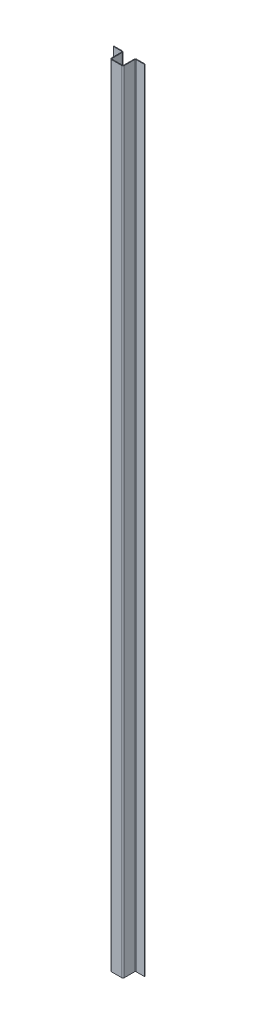
ISO-10303-21;
HEADER;
FILE_DESCRIPTION(('STEP AP214'),'2;1');
FILE_NAME('part.step','',(''),(''),'','','');
FILE_SCHEMA(('AUTOMOTIVE_DESIGN { 1 0 10303 214 1 1 1 1 }'));
ENDSEC;
DATA;
#1=APPLICATION_CONTEXT('core data for automotive mechanical design processes');
#2=APPLICATION_PROTOCOL_DEFINITION('international standard','automotive_design',2000,#1);
#3=PRODUCT_CONTEXT('',#1,'mechanical');
#4=PRODUCT('Part','Part','',(#3));
#5=PRODUCT_RELATED_PRODUCT_CATEGORY('part','',(#4));
#6=PRODUCT_DEFINITION_FORMATION('','',#4);
#7=PRODUCT_DEFINITION_CONTEXT('part definition',#1,'design');
#8=PRODUCT_DEFINITION('design','',#6,#7);
#9=PRODUCT_DEFINITION_SHAPE('','',#8);
#10=(LENGTH_UNIT() NAMED_UNIT(*) SI_UNIT(.MILLI.,.METRE.));
#11=(NAMED_UNIT(*) PLANE_ANGLE_UNIT() SI_UNIT($,.RADIAN.));
#12=(NAMED_UNIT(*) SI_UNIT($,.STERADIAN.) SOLID_ANGLE_UNIT());
#13=UNCERTAINTY_MEASURE_WITH_UNIT(LENGTH_MEASURE(1.E-05),#10,'distance_accuracy_value','');
#14=(GEOMETRIC_REPRESENTATION_CONTEXT(3) GLOBAL_UNCERTAINTY_ASSIGNED_CONTEXT((#13)) GLOBAL_UNIT_ASSIGNED_CONTEXT((#10,
#11,#12)) REPRESENTATION_CONTEXT('',''));
#15=CARTESIAN_POINT('',(0.,0.,0.));
#16=DIRECTION('',(0.,0.,1.));
#17=DIRECTION('',(1.,0.,0.));
#18=AXIS2_PLACEMENT_3D('',#15,#16,#17);
#19=CARTESIAN_POINT('',(19.9999999999963,-1214.,-40.0000000000007));
#20=DIRECTION('',(0.,1.,0.));
#21=DIRECTION('',(0.,0.,1.));
#22=AXIS2_PLACEMENT_3D('',#19,#20,#21);
#23=PLANE('',#22);
#24=DIRECTION('',(-1.,0.,0.));
#25=VECTOR('',#24,1.);
#26=CARTESIAN_POINT('',(19.999999999997,-1214.,-35.5000000000014));
#27=LINE('',#26,#25);
#28=CARTESIAN_POINT('',(19.999999999997,-1214.,-35.5000000000014));
#29=VERTEX_POINT('',#28);
#30=CARTESIAN_POINT('',(17.9999999999962,-1214.,-35.500000000001));
#31=VERTEX_POINT('',#30);
#32=EDGE_CURVE('E316',#29,#31,#27,.T.);
#33=ORIENTED_EDGE('',*,*,#32,.F.);
#34=DIRECTION('',(0.,0.,-1.));
#35=VECTOR('',#34,1.);
#36=CARTESIAN_POINT('',(19.9999999999962,-1214.,-2.22044604925031E-13));
#37=LINE('',#36,#35);
#38=CARTESIAN_POINT('',(19.9999999999964,-1214.,-4.5000000000015));
#39=VERTEX_POINT('',#38);
#40=EDGE_CURVE('E418',#39,#29,#37,.T.);
#41=ORIENTED_EDGE('',*,*,#40,.F.);
#42=DIRECTION('',(-1.,0.,0.));
#43=VECTOR('',#42,1.);
#44=CARTESIAN_POINT('',(17.999999999996,-1214.,-4.50000000000106));
#45=LINE('',#44,#43);
#46=CARTESIAN_POINT('',(17.999999999996,-1214.,-4.50000000000106));
#47=VERTEX_POINT('',#46);
#48=EDGE_CURVE('E429',#47,#39,#45,.F.);
#49=ORIENTED_EDGE('',*,*,#48,.F.);
#50=DIRECTION('',(0.,0.,1.));
#51=VECTOR('',#50,1.);
#52=CARTESIAN_POINT('',(17.9999999999965,-1214.,-40.0000000000018));
#53=LINE('',#52,#51);
#54=EDGE_CURVE('E423',#47,#31,#53,.F.);
#55=ORIENTED_EDGE('',*,*,#54,.T.);
#56=EDGE_LOOP('',(#33,#41,#49,#55));
#57=FACE_BOUND('',#56,.T.);
#58=ADVANCED_FACE('F120',(#57),#23,.F.);
#59=CARTESIAN_POINT('',(20.0000000000028,1214.,-2.00000000000156));
#60=DIRECTION('',(0.,-1.,0.));
#61=DIRECTION('',(0.,0.,-1.));
#62=AXIS2_PLACEMENT_3D('',#59,#60,#61);
#63=PLANE('',#62);
#64=DIRECTION('',(-1.,0.,0.));
#65=VECTOR('',#64,1.);
#66=CARTESIAN_POINT('',(20.0000000000032,1214.,-35.5000000000003));
#67=LINE('',#66,#65);
#68=CARTESIAN_POINT('',(20.0000000000032,1214.,-35.5000000000003));
#69=VERTEX_POINT('',#68);
#70=CARTESIAN_POINT('',(18.0000000000024,1214.,-35.5000000000001));
#71=VERTEX_POINT('',#70);
#72=EDGE_CURVE('E305',#69,#71,#67,.T.);
#73=ORIENTED_EDGE('',*,*,#72,.T.);
#74=DIRECTION('',(0.,0.,-1.));
#75=VECTOR('',#74,1.);
#76=CARTESIAN_POINT('',(18.0000000000025,1214.,-2.00000000000067));
#77=LINE('',#76,#75);
#78=CARTESIAN_POINT('',(18.0000000000022,1214.,-4.50000000000017));
#79=VERTEX_POINT('',#78);
#80=EDGE_CURVE('E421',#71,#79,#77,.F.);
#81=ORIENTED_EDGE('',*,*,#80,.T.);
#82=DIRECTION('',(-1.,0.,0.));
#83=VECTOR('',#82,1.);
#84=CARTESIAN_POINT('',(20.0000000000025,1214.,-4.50000000000084));
#85=LINE('',#84,#83);
#86=CARTESIAN_POINT('',(20.0000000000025,1214.,-4.50000000000084));
#87=VERTEX_POINT('',#86);
#88=EDGE_CURVE('E412',#79,#87,#85,.F.);
#89=ORIENTED_EDGE('',*,*,#88,.T.);
#90=DIRECTION('',(0.,0.,1.));
#91=VECTOR('',#90,1.);
#92=CARTESIAN_POINT('',(20.0000000000026,1214.,-4.44089209850063E-13));
#93=LINE('',#92,#91);
#94=EDGE_CURVE('E415',#69,#87,#93,.T.);
#95=ORIENTED_EDGE('',*,*,#94,.F.);
#96=EDGE_LOOP('',(#73,#81,#89,#95));
#97=FACE_BOUND('',#96,.T.);
#98=ADVANCED_FACE('F514',(#97),#63,.F.);
#99=CARTESIAN_POINT('',(20.,0.,4.44089209850063E-13));
#100=DIRECTION('',(-1.,0.,0.));
#101=DIRECTION('',(0.,0.,1.));
#102=AXIS2_PLACEMENT_3D('',#99,#100,#101);
#103=PLANE('',#102);
#104=DIRECTION('',(0.,1.,0.));
#105=VECTOR('',#104,1.);
#106=CARTESIAN_POINT('',(20.0000000000032,1214.,-35.5000000000003));
#107=LINE('',#106,#105);
#108=EDGE_CURVE('E311',#69,#29,#107,.F.);
#109=ORIENTED_EDGE('',*,*,#108,.F.);
#110=ORIENTED_EDGE('',*,*,#94,.T.);
#111=DIRECTION('',(0.,-1.,0.));
#112=VECTOR('',#111,1.);
#113=CARTESIAN_POINT('',(20.0000000000025,1214.,-4.50000000000084));
#114=LINE('',#113,#112);
#115=EDGE_CURVE('E426',#39,#87,#114,.F.);
#116=ORIENTED_EDGE('',*,*,#115,.F.);
#117=ORIENTED_EDGE('',*,*,#40,.T.);
#118=EDGE_LOOP('',(#109,#110,#116,#117));
#119=FACE_BOUND('',#118,.T.);
#120=ADVANCED_FACE('F520',(#119),#103,.F.);
#121=CARTESIAN_POINT('',(18.0000000000002,-1.11022302462516E-13,4.44089209850063E-13));
#122=DIRECTION('',(-1.,0.,0.));
#123=DIRECTION('',(0.,0.,1.));
#124=AXIS2_PLACEMENT_3D('',#121,#122,#123);
#125=PLANE('',#124);
#126=ORIENTED_EDGE('',*,*,#80,.F.);
#127=DIRECTION('',(0.,1.,0.));
#128=VECTOR('',#127,1.);
#129=CARTESIAN_POINT('',(18.0000000000024,1214.,-35.5000000000001));
#130=LINE('',#129,#128);
#131=EDGE_CURVE('E300',#71,#31,#130,.F.);
#132=ORIENTED_EDGE('',*,*,#131,.T.);
#133=ORIENTED_EDGE('',*,*,#54,.F.);
#134=DIRECTION('',(0.,-1.,0.));
#135=VECTOR('',#134,1.);
#136=CARTESIAN_POINT('',(18.0000000000022,1214.,-4.50000000000017));
#137=LINE('',#136,#135);
#138=EDGE_CURVE('E432',#79,#47,#137,.T.);
#139=ORIENTED_EDGE('',*,*,#138,.F.);
#140=EDGE_LOOP('',(#126,#132,#133,#139));
#141=FACE_BOUND('',#140,.T.);
#142=ADVANCED_FACE('F821',(#141),#125,.T.);
#143=CARTESIAN_POINT('',(-19.9999999999983,1214.,-40.));
#144=DIRECTION('',(0.,-1.,0.));
#145=DIRECTION('',(0.,0.,-1.));
#146=AXIS2_PLACEMENT_3D('',#143,#144,#145);
#147=PLANE('',#146);
#148=DIRECTION('',(1.,0.,0.));
#149=VECTOR('',#148,1.);
#150=CARTESIAN_POINT('',(-19.9999999999984,1214.,-35.4999999999996));
#151=LINE('',#150,#149);
#152=CARTESIAN_POINT('',(-19.9999999999984,1214.,-35.4999999999996));
#153=VERTEX_POINT('',#152);
#154=CARTESIAN_POINT('',(-17.9999999999977,1214.,-35.4999999999996));
#155=VERTEX_POINT('',#154);
#156=EDGE_CURVE('E366',#153,#155,#151,.T.);
#157=ORIENTED_EDGE('',*,*,#156,.F.);
#158=DIRECTION('',(0.,0.,-1.));
#159=VECTOR('',#158,1.);
#160=CARTESIAN_POINT('',(-19.9999999999973,1214.,-4.44089209850063E-13));
#161=LINE('',#160,#159);
#162=CARTESIAN_POINT('',(-19.9999999999981,1214.,-4.4999999999995));
#163=VERTEX_POINT('',#162);
#164=EDGE_CURVE('E374',#163,#153,#161,.T.);
#165=ORIENTED_EDGE('',*,*,#164,.F.);
#166=DIRECTION('',(1.,0.,0.));
#167=VECTOR('',#166,1.);
#168=CARTESIAN_POINT('',(-17.999999999998,1214.,-4.49999999999973));
#169=LINE('',#168,#167);
#170=CARTESIAN_POINT('',(-17.999999999998,1214.,-4.49999999999973));
#171=VERTEX_POINT('',#170);
#172=EDGE_CURVE('E385',#171,#163,#169,.F.);
#173=ORIENTED_EDGE('',*,*,#172,.F.);
#174=DIRECTION('',(0.,0.,1.));
#175=VECTOR('',#174,1.);
#176=CARTESIAN_POINT('',(-17.9999999999971,1214.,-40.));
#177=LINE('',#176,#175);
#178=EDGE_CURVE('E379',#171,#155,#177,.F.);
#179=ORIENTED_EDGE('',*,*,#178,.T.);
#180=EDGE_LOOP('',(#157,#165,#173,#179));
#181=FACE_BOUND('',#180,.T.);
#182=ADVANCED_FACE('F494',(#181),#147,.F.);
#183=CARTESIAN_POINT('',(-20.0000000000038,-1214.,-1.99999999999867));
#184=DIRECTION('',(0.,1.,0.));
#185=DIRECTION('',(0.,0.,1.));
#186=AXIS2_PLACEMENT_3D('',#183,#184,#185);
#187=PLANE('',#186);
#188=DIRECTION('',(1.,0.,0.));
#189=VECTOR('',#188,1.);
#190=CARTESIAN_POINT('',(-20.0000000000042,-1214.,-35.5000000000001));
#191=LINE('',#190,#189);
#192=CARTESIAN_POINT('',(-20.0000000000042,-1214.,-35.5000000000001));
#193=VERTEX_POINT('',#192);
#194=CARTESIAN_POINT('',(-18.0000000000037,-1214.,-35.4999999999996));
#195=VERTEX_POINT('',#194);
#196=EDGE_CURVE('E356',#193,#195,#191,.T.);
#197=ORIENTED_EDGE('',*,*,#196,.T.);
#198=DIRECTION('',(0.,0.,-1.));
#199=VECTOR('',#198,1.);
#200=CARTESIAN_POINT('',(-18.0000000000035,-1214.,-1.99999999999911));
#201=LINE('',#200,#199);
#202=CARTESIAN_POINT('',(-18.0000000000031,-1214.,-4.49999999999973));
#203=VERTEX_POINT('',#202);
#204=EDGE_CURVE('E377',#195,#203,#201,.F.);
#205=ORIENTED_EDGE('',*,*,#204,.T.);
#206=DIRECTION('',(1.,0.,0.));
#207=VECTOR('',#206,1.);
#208=CARTESIAN_POINT('',(-20.0000000000031,-1214.,-4.49999999999973));
#209=LINE('',#208,#207);
#210=CARTESIAN_POINT('',(-20.0000000000031,-1214.,-4.49999999999973));
#211=VERTEX_POINT('',#210);
#212=EDGE_CURVE('E368',#203,#211,#209,.F.);
#213=ORIENTED_EDGE('',*,*,#212,.T.);
#214=DIRECTION('',(0.,0.,1.));
#215=VECTOR('',#214,1.);
#216=CARTESIAN_POINT('',(-20.0000000000028,-1214.,4.44089209850063E-13));
#217=LINE('',#216,#215);
#218=EDGE_CURVE('E371',#193,#211,#217,.T.);
#219=ORIENTED_EDGE('',*,*,#218,.F.);
#220=EDGE_LOOP('',(#197,#205,#213,#219));
#221=FACE_BOUND('',#220,.T.);
#222=ADVANCED_FACE('F841',(#221),#187,.F.);
#223=CARTESIAN_POINT('',(-20.0000000000005,0.,-4.44089209850063E-13));
#224=DIRECTION('',(1.,0.,0.));
#225=DIRECTION('',(0.,0.,-1.));
#226=AXIS2_PLACEMENT_3D('',#223,#224,#225);
#227=PLANE('',#226);
#228=DIRECTION('',(0.,-1.,0.));
#229=VECTOR('',#228,1.);
#230=CARTESIAN_POINT('',(-20.0000000000042,-1214.,-35.5000000000001));
#231=LINE('',#230,#229);
#232=EDGE_CURVE('E362',#193,#153,#231,.F.);
#233=ORIENTED_EDGE('',*,*,#232,.F.);
#234=ORIENTED_EDGE('',*,*,#218,.T.);
#235=DIRECTION('',(0.,1.,0.));
#236=VECTOR('',#235,1.);
#237=CARTESIAN_POINT('',(-20.0000000000031,-1214.,-4.49999999999973));
#238=LINE('',#237,#236);
#239=EDGE_CURVE('E382',#163,#211,#238,.F.);
#240=ORIENTED_EDGE('',*,*,#239,.F.);
#241=ORIENTED_EDGE('',*,*,#164,.T.);
#242=EDGE_LOOP('',(#233,#234,#240,#241));
#243=FACE_BOUND('',#242,.T.);
#244=ADVANCED_FACE('F499',(#243),#227,.F.);
#245=CARTESIAN_POINT('',(-18.,-2.22044604925031E-13,-4.44089209850063E-13));
#246=DIRECTION('',(1.,0.,0.));
#247=DIRECTION('',(0.,0.,-1.));
#248=AXIS2_PLACEMENT_3D('',#245,#246,#247);
#249=PLANE('',#248);
#250=ORIENTED_EDGE('',*,*,#204,.F.);
#251=DIRECTION('',(0.,-1.,0.));
#252=VECTOR('',#251,1.);
#253=CARTESIAN_POINT('',(-18.0000000000037,-1214.,-35.4999999999996));
#254=LINE('',#253,#252);
#255=EDGE_CURVE('E351',#195,#155,#254,.F.);
#256=ORIENTED_EDGE('',*,*,#255,.T.);
#257=ORIENTED_EDGE('',*,*,#178,.F.);
#258=DIRECTION('',(0.,1.,0.));
#259=VECTOR('',#258,1.);
#260=CARTESIAN_POINT('',(-18.0000000000031,-1214.,-4.49999999999973));
#261=LINE('',#260,#259);
#262=EDGE_CURVE('E388',#203,#171,#261,.T.);
#263=ORIENTED_EDGE('',*,*,#262,.F.);
#264=EDGE_LOOP('',(#250,#256,#257,#263));
#265=FACE_BOUND('',#264,.T.);
#266=ADVANCED_FACE('F491',(#265),#249,.T.);
#267=CARTESIAN_POINT('',(-7.7715611723761E-13,-2.22044604925031E-13,-2.00000000000067));
#268=DIRECTION('',(0.,0.,1.));
#269=DIRECTION('',(1.,0.,0.));
#270=AXIS2_PLACEMENT_3D('',#267,#268,#269);
#271=PLANE('',#270);
#272=DIRECTION('',(0.,1.,0.));
#273=VECTOR('',#272,1.);
#274=CARTESIAN_POINT('',(-15.4999999999981,1214.,-1.99999999999911));
#275=LINE('',#274,#273);
#276=CARTESIAN_POINT('',(-15.4999999999981,1214.,-1.99999999999911));
#277=VERTEX_POINT('',#276);
#278=CARTESIAN_POINT('',(-15.5000000000037,-1214.,-1.99999999999978));
#279=VERTEX_POINT('',#278);
#280=EDGE_CURVE('E405',#277,#279,#275,.F.);
#281=ORIENTED_EDGE('',*,*,#280,.F.);
#282=DIRECTION('',(-1.,0.,0.));
#283=VECTOR('',#282,1.);
#284=CARTESIAN_POINT('',(20.0000000000028,1214.,-2.00000000000156));
#285=LINE('',#284,#283);
#286=CARTESIAN_POINT('',(15.5000000000022,1214.,-2.00000000000067));
#287=VERTEX_POINT('',#286);
#288=EDGE_CURVE('E13',#287,#277,#285,.T.);
#289=ORIENTED_EDGE('',*,*,#288,.F.);
#290=DIRECTION('',(0.,-1.,0.));
#291=VECTOR('',#290,1.);
#292=CARTESIAN_POINT('',(15.499999999997,-1214.,-2.000000000002));
#293=LINE('',#292,#291);
#294=CARTESIAN_POINT('',(15.499999999997,-1214.,-2.000000000002));
#295=VERTEX_POINT('',#294);
#296=EDGE_CURVE('E449',#295,#287,#293,.F.);
#297=ORIENTED_EDGE('',*,*,#296,.F.);
#298=DIRECTION('',(1.,0.,0.));
#299=VECTOR('',#298,1.);
#300=CARTESIAN_POINT('',(19.9999999999967,-1214.,-2.00000000000156));
#301=LINE('',#300,#299);
#302=EDGE_CURVE('E129',#279,#295,#301,.T.);
#303=ORIENTED_EDGE('',*,*,#302,.F.);
#304=EDGE_LOOP('',(#281,#289,#297,#303));
#305=FACE_BOUND('',#304,.T.);
#306=ADVANCED_FACE('F481',(#305),#271,.F.);
#307=CARTESIAN_POINT('',(0.,0.,0.));
#308=DIRECTION('',(0.,0.,1.));
#309=DIRECTION('',(1.,0.,0.));
#310=AXIS2_PLACEMENT_3D('',#307,#308,#309);
#311=PLANE('',#310);
#312=DIRECTION('',(-1.,0.,0.));
#313=VECTOR('',#312,1.);
#314=CARTESIAN_POINT('',(20.0000000000026,1214.,-4.44089209850063E-13));
#315=LINE('',#314,#313);
#316=CARTESIAN_POINT('',(15.5000000000021,1214.,2.22044604925031E-13));
#317=VERTEX_POINT('',#316);
#318=CARTESIAN_POINT('',(-15.4999999999975,1214.,-8.88178419700125E-13));
#319=VERTEX_POINT('',#318);
#320=EDGE_CURVE('E124',#317,#319,#315,.T.);
#321=ORIENTED_EDGE('',*,*,#320,.T.);
#322=DIRECTION('',(0.,1.,0.));
#323=VECTOR('',#322,1.);
#324=CARTESIAN_POINT('',(-15.4999999999975,1214.,-8.88178419700125E-13));
#325=LINE('',#324,#323);
#326=CARTESIAN_POINT('',(-15.5000000000031,-1214.,1.55431223447522E-12));
#327=VERTEX_POINT('',#326);
#328=EDGE_CURVE('E392',#319,#327,#325,.F.);
#329=ORIENTED_EDGE('',*,*,#328,.T.);
#330=DIRECTION('',(1.,0.,0.));
#331=VECTOR('',#330,1.);
#332=CARTESIAN_POINT('',(19.9999999999962,-1214.,-2.22044604925031E-13));
#333=LINE('',#332,#331);
#334=CARTESIAN_POINT('',(15.4999999999961,-1214.,-4.44089209850063E-13));
#335=VERTEX_POINT('',#334);
#336=EDGE_CURVE('E456',#327,#335,#333,.T.);
#337=ORIENTED_EDGE('',*,*,#336,.T.);
#338=DIRECTION('',(0.,-1.,0.));
#339=VECTOR('',#338,1.);
#340=CARTESIAN_POINT('',(15.4999999999961,-1214.,-4.44089209850063E-13));
#341=LINE('',#340,#339);
#342=EDGE_CURVE('E436',#335,#317,#341,.F.);
#343=ORIENTED_EDGE('',*,*,#342,.T.);
#344=EDGE_LOOP('',(#321,#329,#337,#343));
#345=FACE_BOUND('',#344,.T.);
#346=ADVANCED_FACE('F465',(#345),#311,.T.);
#347=CARTESIAN_POINT('',(20.0000000000028,1214.,-2.00000000000156));
#348=DIRECTION('',(0.,1.,0.));
#349=DIRECTION('',(0.,0.,1.));
#350=AXIS2_PLACEMENT_3D('',#347,#348,#349);
#351=PLANE('',#350);
#352=ORIENTED_EDGE('',*,*,#288,.T.);
#353=DIRECTION('',(0.,0.,1.));
#354=VECTOR('',#353,1.);
#355=CARTESIAN_POINT('',(-15.4999999999981,1214.,-1.99999999999911));
#356=LINE('',#355,#354);
#357=EDGE_CURVE('E399',#277,#319,#356,.T.);
#358=ORIENTED_EDGE('',*,*,#357,.T.);
#359=ORIENTED_EDGE('',*,*,#320,.F.);
#360=DIRECTION('',(0.,0.,1.));
#361=VECTOR('',#360,1.);
#362=CARTESIAN_POINT('',(15.5000000000022,1214.,-2.00000000000067));
#363=LINE('',#362,#361);
#364=EDGE_CURVE('E453',#287,#317,#363,.T.);
#365=ORIENTED_EDGE('',*,*,#364,.F.);
#366=EDGE_LOOP('',(#352,#358,#359,#365));
#367=FACE_BOUND('',#366,.T.);
#368=ADVANCED_FACE('F468',(#367),#351,.T.);
#369=CARTESIAN_POINT('',(19.9999999999967,-1214.,-2.00000000000156));
#370=DIRECTION('',(0.,-1.,0.));
#371=DIRECTION('',(0.,0.,-1.));
#372=AXIS2_PLACEMENT_3D('',#369,#370,#371);
#373=PLANE('',#372);
#374=DIRECTION('',(0.,0.,1.));
#375=VECTOR('',#374,1.);
#376=CARTESIAN_POINT('',(-15.5000000000037,-1214.,-1.99999999999978));
#377=LINE('',#376,#375);
#378=EDGE_CURVE('E409',#279,#327,#377,.T.);
#379=ORIENTED_EDGE('',*,*,#378,.F.);
#380=ORIENTED_EDGE('',*,*,#302,.T.);
#381=DIRECTION('',(0.,0.,1.));
#382=VECTOR('',#381,1.);
#383=CARTESIAN_POINT('',(15.499999999997,-1214.,-2.000000000002));
#384=LINE('',#383,#382);
#385=EDGE_CURVE('E443',#295,#335,#384,.T.);
#386=ORIENTED_EDGE('',*,*,#385,.T.);
#387=ORIENTED_EDGE('',*,*,#336,.F.);
#388=EDGE_LOOP('',(#379,#380,#386,#387));
#389=FACE_BOUND('',#388,.T.);
#390=ADVANCED_FACE('F122',(#389),#373,.T.);
#391=CARTESIAN_POINT('',(15.5000000000026,1214.,-4.50000000000061));
#392=DIRECTION('',(0.,1.,0.));
#393=DIRECTION('',(0.,0.,1.));
#394=AXIS2_PLACEMENT_3D('',#391,#392,#393);
#395=PLANE('',#394);
#396=ORIENTED_EDGE('',*,*,#88,.F.);
#397=CARTESIAN_POINT('',(15.5000000000026,1214.,-4.50000000000061));
#398=DIRECTION('',(0.,-1.,0.));
#399=DIRECTION('',(0.,0.,-1.));
#400=AXIS2_PLACEMENT_3D('',#397,#398,#399);
#401=CIRCLE('',#400,2.5);
#402=EDGE_CURVE('E446',#287,#79,#401,.F.);
#403=ORIENTED_EDGE('',*,*,#402,.F.);
#404=ORIENTED_EDGE('',*,*,#364,.T.);
#405=CARTESIAN_POINT('',(15.5000000000026,1214.,-4.50000000000061));
#406=DIRECTION('',(0.,-1.,0.));
#407=DIRECTION('',(0.,0.,-1.));
#408=AXIS2_PLACEMENT_3D('',#405,#406,#407);
#409=CIRCLE('',#408,4.5);
#410=EDGE_CURVE('E439',#317,#87,#409,.F.);
#411=ORIENTED_EDGE('',*,*,#410,.T.);
#412=EDGE_LOOP('',(#396,#403,#404,#411));
#413=FACE_BOUND('',#412,.T.);
#414=ADVANCED_FACE('F535',(#413),#395,.T.);
#415=CARTESIAN_POINT('',(15.499999999996,-1214.,-4.50000000000017));
#416=DIRECTION('',(0.,1.,0.));
#417=DIRECTION('',(0.,0.,1.));
#418=AXIS2_PLACEMENT_3D('',#415,#416,#417);
#419=PLANE('',#418);
#420=CARTESIAN_POINT('',(15.499999999996,-1214.,-4.50000000000017));
#421=DIRECTION('',(0.,-1.,0.));
#422=DIRECTION('',(0.,0.,-1.));
#423=AXIS2_PLACEMENT_3D('',#420,#421,#422);
#424=CIRCLE('',#423,2.5);
#425=EDGE_CURVE('E417',#47,#295,#424,.T.);
#426=ORIENTED_EDGE('',*,*,#425,.F.);
#427=ORIENTED_EDGE('',*,*,#48,.T.);
#428=CARTESIAN_POINT('',(15.499999999996,-1214.,-4.50000000000017));
#429=DIRECTION('',(0.,-1.,0.));
#430=DIRECTION('',(0.,0.,-1.));
#431=AXIS2_PLACEMENT_3D('',#428,#429,#430);
#432=CIRCLE('',#431,4.5);
#433=EDGE_CURVE('E440',#39,#335,#432,.T.);
#434=ORIENTED_EDGE('',*,*,#433,.T.);
#435=ORIENTED_EDGE('',*,*,#385,.F.);
#436=EDGE_LOOP('',(#426,#427,#434,#435));
#437=FACE_BOUND('',#436,.T.);
#438=ADVANCED_FACE('F530',(#437),#419,.F.);
#439=CARTESIAN_POINT('',(15.499999999996,-1214.,-4.50000000000017));
#440=DIRECTION('',(0.,-1.,0.));
#441=DIRECTION('',(1.,0.,0.));
#442=AXIS2_PLACEMENT_3D('',#439,#440,#441);
#443=CYLINDRICAL_SURFACE('',#442,4.5);
#444=ORIENTED_EDGE('',*,*,#342,.F.);
#445=ORIENTED_EDGE('',*,*,#433,.F.);
#446=ORIENTED_EDGE('',*,*,#115,.T.);
#447=ORIENTED_EDGE('',*,*,#410,.F.);
#448=EDGE_LOOP('',(#444,#445,#446,#447));
#449=FACE_BOUND('',#448,.T.);
#450=ADVANCED_FACE('F526',(#449),#443,.T.);
#451=CARTESIAN_POINT('',(15.499999999996,-1214.,-4.50000000000017));
#452=DIRECTION('',(0.,-1.,0.));
#453=DIRECTION('',(1.,0.,0.));
#454=AXIS2_PLACEMENT_3D('',#451,#452,#453);
#455=CYLINDRICAL_SURFACE('',#454,2.5);
#456=ORIENTED_EDGE('',*,*,#296,.T.);
#457=ORIENTED_EDGE('',*,*,#402,.T.);
#458=ORIENTED_EDGE('',*,*,#138,.T.);
#459=ORIENTED_EDGE('',*,*,#425,.T.);
#460=EDGE_LOOP('',(#456,#457,#458,#459));
#461=FACE_BOUND('',#460,.T.);
#462=ADVANCED_FACE('F529',(#461),#455,.F.);
#463=CARTESIAN_POINT('',(-15.5000000000036,-1214.,-4.49999999999906));
#464=DIRECTION('',(0.,-1.,0.));
#465=DIRECTION('',(0.,0.,-1.));
#466=AXIS2_PLACEMENT_3D('',#463,#464,#465);
#467=PLANE('',#466);
#468=ORIENTED_EDGE('',*,*,#212,.F.);
#469=CARTESIAN_POINT('',(-15.5000000000036,-1214.,-4.49999999999906));
#470=DIRECTION('',(0.,1.,0.));
#471=DIRECTION('',(0.,0.,1.));
#472=AXIS2_PLACEMENT_3D('',#469,#470,#471);
#473=CIRCLE('',#472,2.5);
#474=EDGE_CURVE('E402',#279,#203,#473,.F.);
#475=ORIENTED_EDGE('',*,*,#474,.F.);
#476=ORIENTED_EDGE('',*,*,#378,.T.);
#477=CARTESIAN_POINT('',(-15.5000000000036,-1214.,-4.49999999999906));
#478=DIRECTION('',(0.,1.,0.));
#479=DIRECTION('',(0.,0.,1.));
#480=AXIS2_PLACEMENT_3D('',#477,#478,#479);
#481=CIRCLE('',#480,4.5);
#482=EDGE_CURVE('E395',#327,#211,#481,.F.);
#483=ORIENTED_EDGE('',*,*,#482,.T.);
#484=EDGE_LOOP('',(#468,#475,#476,#483));
#485=FACE_BOUND('',#484,.T.);
#486=ADVANCED_FACE('F487',(#485),#467,.T.);
#487=CARTESIAN_POINT('',(-15.4999999999986,1214.,-4.4999999999995));
#488=DIRECTION('',(0.,-1.,0.));
#489=DIRECTION('',(0.,0.,-1.));
#490=AXIS2_PLACEMENT_3D('',#487,#488,#489);
#491=PLANE('',#490);
#492=CARTESIAN_POINT('',(-15.4999999999986,1214.,-4.4999999999995));
#493=DIRECTION('',(0.,1.,0.));
#494=DIRECTION('',(0.,0.,1.));
#495=AXIS2_PLACEMENT_3D('',#492,#493,#494);
#496=CIRCLE('',#495,2.5);
#497=EDGE_CURVE('E373',#171,#277,#496,.T.);
#498=ORIENTED_EDGE('',*,*,#497,.F.);
#499=ORIENTED_EDGE('',*,*,#172,.T.);
#500=CARTESIAN_POINT('',(-15.4999999999986,1214.,-4.4999999999995));
#501=DIRECTION('',(0.,1.,0.));
#502=DIRECTION('',(0.,0.,1.));
#503=AXIS2_PLACEMENT_3D('',#500,#501,#502);
#504=CIRCLE('',#503,4.5);
#505=EDGE_CURVE('E396',#163,#319,#504,.T.);
#506=ORIENTED_EDGE('',*,*,#505,.T.);
#507=ORIENTED_EDGE('',*,*,#357,.F.);
#508=EDGE_LOOP('',(#498,#499,#506,#507));
#509=FACE_BOUND('',#508,.T.);
#510=ADVANCED_FACE('F472',(#509),#491,.F.);
#511=CARTESIAN_POINT('',(-15.4999999999986,1214.,-4.4999999999995));
#512=DIRECTION('',(0.,1.,0.));
#513=DIRECTION('',(-1.,0.,0.));
#514=AXIS2_PLACEMENT_3D('',#511,#512,#513);
#515=CYLINDRICAL_SURFACE('',#514,4.5);
#516=ORIENTED_EDGE('',*,*,#328,.F.);
#517=ORIENTED_EDGE('',*,*,#505,.F.);
#518=ORIENTED_EDGE('',*,*,#239,.T.);
#519=ORIENTED_EDGE('',*,*,#482,.F.);
#520=EDGE_LOOP('',(#516,#517,#518,#519));
#521=FACE_BOUND('',#520,.T.);
#522=ADVANCED_FACE('F502',(#521),#515,.T.);
#523=CARTESIAN_POINT('',(-15.4999999999986,1214.,-4.4999999999995));
#524=DIRECTION('',(0.,1.,0.));
#525=DIRECTION('',(-1.,0.,0.));
#526=AXIS2_PLACEMENT_3D('',#523,#524,#525);
#527=CYLINDRICAL_SURFACE('',#526,2.5);
#528=ORIENTED_EDGE('',*,*,#280,.T.);
#529=ORIENTED_EDGE('',*,*,#474,.T.);
#530=ORIENTED_EDGE('',*,*,#262,.T.);
#531=ORIENTED_EDGE('',*,*,#497,.T.);
#532=EDGE_LOOP('',(#528,#529,#530,#531));
#533=FACE_BOUND('',#532,.T.);
#534=ADVANCED_FACE('F476',(#533),#527,.F.);
#535=CARTESIAN_POINT('',(-22.4999999999979,1214.,-35.5000000000001));
#536=DIRECTION('',(0.,1.,0.));
#537=DIRECTION('',(0.,0.,1.));
#538=AXIS2_PLACEMENT_3D('',#535,#536,#537);
#539=PLANE('',#538);
#540=DIRECTION('',(0.,0.,1.));
#541=VECTOR('',#540,1.);
#542=CARTESIAN_POINT('',(-22.4999999999976,1214.,-39.9999999999998));
#543=LINE('',#542,#541);
#544=CARTESIAN_POINT('',(-22.4999999999977,1214.,-38.0000000000003));
#545=VERTEX_POINT('',#544);
#546=CARTESIAN_POINT('',(-22.4999999999976,1214.,-39.9999999999998));
#547=VERTEX_POINT('',#546);
#548=EDGE_CURVE('E318',#545,#547,#543,.F.);
#549=ORIENTED_EDGE('',*,*,#548,.F.);
#550=CARTESIAN_POINT('',(-22.4999999999979,1214.,-35.5000000000001));
#551=DIRECTION('',(0.,-1.,0.));
#552=DIRECTION('',(0.,0.,-1.));
#553=AXIS2_PLACEMENT_3D('',#550,#551,#552);
#554=CIRCLE('',#553,2.50000000000001);
#555=EDGE_CURVE('E359',#153,#545,#554,.F.);
#556=ORIENTED_EDGE('',*,*,#555,.F.);
#557=ORIENTED_EDGE('',*,*,#156,.T.);
#558=CARTESIAN_POINT('',(-22.4999999999979,1214.,-35.5000000000001));
#559=DIRECTION('',(0.,-1.,0.));
#560=DIRECTION('',(0.,0.,-1.));
#561=AXIS2_PLACEMENT_3D('',#558,#559,#560);
#562=CIRCLE('',#561,4.50000000000001);
#563=EDGE_CURVE('E145',#155,#547,#562,.F.);
#564=ORIENTED_EDGE('',*,*,#563,.T.);
#565=EDGE_LOOP('',(#549,#556,#557,#564));
#566=FACE_BOUND('',#565,.T.);
#567=ADVANCED_FACE('F509',(#566),#539,.T.);
#568=CARTESIAN_POINT('',(-22.5000000000049,-1214.,-35.4999999999992));
#569=DIRECTION('',(0.,1.,0.));
#570=DIRECTION('',(0.,0.,1.));
#571=AXIS2_PLACEMENT_3D('',#568,#569,#570);
#572=PLANE('',#571);
#573=CARTESIAN_POINT('',(-22.5000000000049,-1214.,-35.4999999999992));
#574=DIRECTION('',(0.,-1.,0.));
#575=DIRECTION('',(0.,0.,-1.));
#576=AXIS2_PLACEMENT_3D('',#573,#574,#575);
#577=CIRCLE('',#576,2.50000000000001);
#578=CARTESIAN_POINT('',(-22.500000000003,-1214.,-37.9999999999998));
#579=VERTEX_POINT('',#578);
#580=EDGE_CURVE('E324',#579,#193,#577,.T.);
#581=ORIENTED_EDGE('',*,*,#580,.F.);
#582=DIRECTION('',(0.,0.,1.));
#583=VECTOR('',#582,1.);
#584=CARTESIAN_POINT('',(-22.5000000000034,-1214.,-37.9999999999989));
#585=LINE('',#584,#583);
#586=CARTESIAN_POINT('',(-22.5000000000039,-1214.,-39.9999999999996));
#587=VERTEX_POINT('',#586);
#588=EDGE_CURVE('E344',#579,#587,#585,.F.);
#589=ORIENTED_EDGE('',*,*,#588,.T.);
#590=CARTESIAN_POINT('',(-22.5000000000049,-1214.,-35.4999999999992));
#591=DIRECTION('',(0.,-1.,0.));
#592=DIRECTION('',(0.,0.,-1.));
#593=AXIS2_PLACEMENT_3D('',#590,#591,#592);
#594=CIRCLE('',#593,4.50000000000001);
#595=EDGE_CURVE('E354',#587,#195,#594,.T.);
#596=ORIENTED_EDGE('',*,*,#595,.T.);
#597=ORIENTED_EDGE('',*,*,#196,.F.);
#598=EDGE_LOOP('',(#581,#589,#596,#597));
#599=FACE_BOUND('',#598,.T.);
#600=ADVANCED_FACE('F600',(#599),#572,.F.);
#601=CARTESIAN_POINT('',(-22.5000000000049,-1214.,-35.4999999999992));
#602=DIRECTION('',(0.,-1.,0.));
#603=DIRECTION('',(0.,0.,-1.));
#604=AXIS2_PLACEMENT_3D('',#601,#602,#603);
#605=CYLINDRICAL_SURFACE('',#604,4.50000000000001);
#606=ORIENTED_EDGE('',*,*,#255,.F.);
#607=ORIENTED_EDGE('',*,*,#595,.F.);
#608=DIRECTION('',(0.,-1.,0.));
#609=VECTOR('',#608,1.);
#610=CARTESIAN_POINT('',(-22.4999999999976,1214.,-39.9999999999998));
#611=LINE('',#610,#609);
#612=EDGE_CURVE('E342',#587,#547,#611,.F.);
#613=ORIENTED_EDGE('',*,*,#612,.T.);
#614=ORIENTED_EDGE('',*,*,#563,.F.);
#615=EDGE_LOOP('',(#606,#607,#613,#614));
#616=FACE_BOUND('',#615,.T.);
#617=ADVANCED_FACE('F612',(#616),#605,.T.);
#618=CARTESIAN_POINT('',(-22.5000000000049,-1214.,-35.4999999999992));
#619=DIRECTION('',(0.,-1.,0.));
#620=DIRECTION('',(0.,0.,-1.));
#621=AXIS2_PLACEMENT_3D('',#618,#619,#620);
#622=CYLINDRICAL_SURFACE('',#621,2.50000000000001);
#623=ORIENTED_EDGE('',*,*,#232,.T.);
#624=ORIENTED_EDGE('',*,*,#555,.T.);
#625=DIRECTION('',(0.,-1.,0.));
#626=VECTOR('',#625,1.);
#627=CARTESIAN_POINT('',(-22.4999999999977,1214.,-38.0000000000003));
#628=LINE('',#627,#626);
#629=EDGE_CURVE('E347',#545,#579,#628,.T.);
#630=ORIENTED_EDGE('',*,*,#629,.T.);
#631=ORIENTED_EDGE('',*,*,#580,.T.);
#632=EDGE_LOOP('',(#623,#624,#630,#631));
#633=FACE_BOUND('',#632,.T.);
#634=ADVANCED_FACE('F623',(#633),#622,.F.);
#635=CARTESIAN_POINT('',(-48.0000000000035,-1214.,-40.0000000000014));
#636=DIRECTION('',(0.,1.,0.));
#637=DIRECTION('',(0.,0.,1.));
#638=AXIS2_PLACEMENT_3D('',#635,#636,#637);
#639=PLANE('',#638);
#640=ORIENTED_EDGE('',*,*,#588,.F.);
#641=DIRECTION('',(1.,0.,0.));
#642=VECTOR('',#641,1.);
#643=CARTESIAN_POINT('',(-48.0000000000027,-1214.,-38.000000000002));
#644=LINE('',#643,#642);
#645=CARTESIAN_POINT('',(-48.0000000000027,-1214.,-38.000000000002));
#646=VERTEX_POINT('',#645);
#647=EDGE_CURVE('E340',#579,#646,#644,.F.);
#648=ORIENTED_EDGE('',*,*,#647,.T.);
#649=DIRECTION('',(0.,0.,1.));
#650=VECTOR('',#649,1.);
#651=CARTESIAN_POINT('',(-48.0000000000035,-1214.,-40.0000000000014));
#652=LINE('',#651,#650);
#653=CARTESIAN_POINT('',(-48.0000000000035,-1214.,-40.0000000000014));
#654=VERTEX_POINT('',#653);
#655=EDGE_CURVE('E321',#654,#646,#652,.T.);
#656=ORIENTED_EDGE('',*,*,#655,.F.);
#657=DIRECTION('',(-1.,0.,0.));
#658=VECTOR('',#657,1.);
#659=CARTESIAN_POINT('',(-3.38618022510673E-12,-1214.,-39.9999999999991));
#660=LINE('',#659,#658);
#661=EDGE_CURVE('E333',#587,#654,#660,.T.);
#662=ORIENTED_EDGE('',*,*,#661,.F.);
#663=EDGE_LOOP('',(#640,#648,#656,#662));
#664=FACE_BOUND('',#663,.T.);
#665=ADVANCED_FACE('F633',(#664),#639,.F.);
#666=CARTESIAN_POINT('',(-19.9999999999983,1214.,-40.));
#667=DIRECTION('',(0.,-1.,0.));
#668=DIRECTION('',(0.,0.,-1.));
#669=AXIS2_PLACEMENT_3D('',#666,#667,#668);
#670=PLANE('',#669);
#671=ORIENTED_EDGE('',*,*,#548,.T.);
#672=DIRECTION('',(1.,0.,0.));
#673=VECTOR('',#672,1.);
#674=CARTESIAN_POINT('',(1.99840144432528E-12,1214.00000000001,-40.0000000000014));
#675=LINE('',#674,#673);
#676=CARTESIAN_POINT('',(-47.9999999999982,1214.,-40.0000000000014));
#677=VERTEX_POINT('',#676);
#678=EDGE_CURVE('E328',#677,#547,#675,.T.);
#679=ORIENTED_EDGE('',*,*,#678,.F.);
#680=DIRECTION('',(0.,0.,1.));
#681=VECTOR('',#680,1.);
#682=CARTESIAN_POINT('',(-47.9999999999982,1214.,-40.0000000000014));
#683=LINE('',#682,#681);
#684=CARTESIAN_POINT('',(-47.9999999999982,1214.,-38.0000000000009));
#685=VERTEX_POINT('',#684);
#686=EDGE_CURVE('E325',#677,#685,#683,.T.);
#687=ORIENTED_EDGE('',*,*,#686,.T.);
#688=DIRECTION('',(-1.,0.,0.));
#689=VECTOR('',#688,1.);
#690=CARTESIAN_POINT('',(-19.999999999998,1214.,-37.9999999999996));
#691=LINE('',#690,#689);
#692=EDGE_CURVE('E335',#685,#545,#691,.F.);
#693=ORIENTED_EDGE('',*,*,#692,.T.);
#694=EDGE_LOOP('',(#671,#679,#687,#693));
#695=FACE_BOUND('',#694,.T.);
#696=ADVANCED_FACE('F644',(#695),#670,.F.);
#697=CARTESIAN_POINT('',(2.22044604925031E-13,-6.66133814775094E-13,-40.0000000000009));
#698=DIRECTION('',(0.,0.,1.));
#699=DIRECTION('',(1.,0.,0.));
#700=AXIS2_PLACEMENT_3D('',#697,#698,#699);
#701=PLANE('',#700);
#702=ORIENTED_EDGE('',*,*,#612,.F.);
#703=ORIENTED_EDGE('',*,*,#661,.T.);
#704=DIRECTION('',(0.,1.,0.));
#705=VECTOR('',#704,1.);
#706=CARTESIAN_POINT('',(-48.0000000000002,1.11022302462516E-13,-39.9999999999996));
#707=LINE('',#706,#705);
#708=EDGE_CURVE('E331',#654,#677,#707,.T.);
#709=ORIENTED_EDGE('',*,*,#708,.T.);
#710=ORIENTED_EDGE('',*,*,#678,.T.);
#711=EDGE_LOOP('',(#702,#703,#709,#710));
#712=FACE_BOUND('',#711,.T.);
#713=ADVANCED_FACE('F655',(#712),#701,.F.);
#714=CARTESIAN_POINT('',(-2.22044604925031E-13,-9.99200722162641E-13,-38.0000000000003));
#715=DIRECTION('',(0.,0.,1.));
#716=DIRECTION('',(1.,0.,0.));
#717=AXIS2_PLACEMENT_3D('',#714,#715,#716);
#718=PLANE('',#717);
#719=ORIENTED_EDGE('',*,*,#647,.F.);
#720=ORIENTED_EDGE('',*,*,#629,.F.);
#721=ORIENTED_EDGE('',*,*,#692,.F.);
#722=DIRECTION('',(0.,-1.,0.));
#723=VECTOR('',#722,1.);
#724=CARTESIAN_POINT('',(-47.9999999999982,1214.,-38.0000000000009));
#725=LINE('',#724,#723);
#726=EDGE_CURVE('E338',#646,#685,#725,.F.);
#727=ORIENTED_EDGE('',*,*,#726,.F.);
#728=EDGE_LOOP('',(#719,#720,#721,#727));
#729=FACE_BOUND('',#728,.T.);
#730=ADVANCED_FACE('F666',(#729),#718,.T.);
#731=CARTESIAN_POINT('',(-47.9999999999982,1214.,-40.0000000000014));
#732=DIRECTION('',(1.,0.,0.));
#733=DIRECTION('',(0.,0.,-1.));
#734=AXIS2_PLACEMENT_3D('',#731,#732,#733);
#735=PLANE('',#734);
#736=ORIENTED_EDGE('',*,*,#726,.T.);
#737=ORIENTED_EDGE('',*,*,#686,.F.);
#738=ORIENTED_EDGE('',*,*,#708,.F.);
#739=ORIENTED_EDGE('',*,*,#655,.T.);
#740=EDGE_LOOP('',(#736,#737,#738,#739));
#741=FACE_BOUND('',#740,.T.);
#742=ADVANCED_FACE('F677',(#741),#735,.F.);
#743=CARTESIAN_POINT('',(22.4999999999967,-1214.,-35.5000000000012));
#744=DIRECTION('',(0.,-1.,0.));
#745=DIRECTION('',(0.,0.,-1.));
#746=AXIS2_PLACEMENT_3D('',#743,#744,#745);
#747=PLANE('',#746);
#748=DIRECTION('',(0.,0.,1.));
#749=VECTOR('',#748,1.);
#750=CARTESIAN_POINT('',(22.4999999999961,-1214.,-40.0000000000014));
#751=LINE('',#750,#749);
#752=CARTESIAN_POINT('',(22.4999999999965,-1214.,-38.0000000000011));
#753=VERTEX_POINT('',#752);
#754=CARTESIAN_POINT('',(22.4999999999961,-1214.,-40.0000000000009));
#755=VERTEX_POINT('',#754);
#756=EDGE_CURVE('E283',#753,#755,#751,.F.);
#757=ORIENTED_EDGE('',*,*,#756,.F.);
#758=CARTESIAN_POINT('',(22.4999999999967,-1214.,-35.5000000000012));
#759=DIRECTION('',(0.,1.,0.));
#760=DIRECTION('',(0.,0.,1.));
#761=AXIS2_PLACEMENT_3D('',#758,#759,#760);
#762=CIRCLE('',#761,2.50000000000001);
#763=EDGE_CURVE('E308',#29,#753,#762,.F.);
#764=ORIENTED_EDGE('',*,*,#763,.F.);
#765=ORIENTED_EDGE('',*,*,#32,.T.);
#766=CARTESIAN_POINT('',(22.4999999999967,-1214.,-35.5000000000012));
#767=DIRECTION('',(0.,1.,0.));
#768=DIRECTION('',(0.,0.,1.));
#769=AXIS2_PLACEMENT_3D('',#766,#767,#768);
#770=CIRCLE('',#769,4.50000000000001);
#771=EDGE_CURVE('E137',#31,#755,#770,.F.);
#772=ORIENTED_EDGE('',*,*,#771,.T.);
#773=EDGE_LOOP('',(#757,#764,#765,#772));
#774=FACE_BOUND('',#773,.T.);
#775=ADVANCED_FACE('F688',(#774),#747,.T.);
#776=CARTESIAN_POINT('',(22.500000000002,1214.,-35.4999999999999));
#777=DIRECTION('',(0.,-1.,0.));
#778=DIRECTION('',(0.,0.,-1.));
#779=AXIS2_PLACEMENT_3D('',#776,#777,#778);
#780=PLANE('',#779);
#781=CARTESIAN_POINT('',(22.500000000002,1214.,-35.4999999999999));
#782=DIRECTION('',(0.,1.,0.));
#783=DIRECTION('',(0.,0.,1.));
#784=AXIS2_PLACEMENT_3D('',#781,#782,#783);
#785=CIRCLE('',#784,2.50000000000001);
#786=CARTESIAN_POINT('',(22.5000000000027,1214.,-38.0000000000009));
#787=VERTEX_POINT('',#786);
#788=EDGE_CURVE('E313',#787,#69,#785,.T.);
#789=ORIENTED_EDGE('',*,*,#788,.F.);
#790=DIRECTION('',(0.,0.,1.));
#791=VECTOR('',#790,1.);
#792=CARTESIAN_POINT('',(22.5000000000027,1214.,-38.0000000000009));
#793=LINE('',#792,#791);
#794=CARTESIAN_POINT('',(22.5000000000027,1214.,-40.0000000000009));
#795=VERTEX_POINT('',#794);
#796=EDGE_CURVE('E294',#787,#795,#793,.F.);
#797=ORIENTED_EDGE('',*,*,#796,.T.);
#798=CARTESIAN_POINT('',(22.500000000002,1214.,-35.4999999999999));
#799=DIRECTION('',(0.,1.,0.));
#800=DIRECTION('',(0.,0.,1.));
#801=AXIS2_PLACEMENT_3D('',#798,#799,#800);
#802=CIRCLE('',#801,4.50000000000001);
#803=EDGE_CURVE('E303',#795,#71,#802,.T.);
#804=ORIENTED_EDGE('',*,*,#803,.T.);
#805=ORIENTED_EDGE('',*,*,#72,.F.);
#806=EDGE_LOOP('',(#789,#797,#804,#805));
#807=FACE_BOUND('',#806,.T.);
#808=ADVANCED_FACE('F699',(#807),#780,.F.);
#809=CARTESIAN_POINT('',(22.500000000002,1214.,-35.4999999999999));
#810=DIRECTION('',(0.,1.,0.));
#811=DIRECTION('',(0.,0.,-1.));
#812=AXIS2_PLACEMENT_3D('',#809,#810,#811);
#813=CYLINDRICAL_SURFACE('',#812,4.50000000000001);
#814=ORIENTED_EDGE('',*,*,#131,.F.);
#815=ORIENTED_EDGE('',*,*,#803,.F.);
#816=DIRECTION('',(0.,1.,0.));
#817=VECTOR('',#816,1.);
#818=CARTESIAN_POINT('',(22.4999999999961,-1214.,-40.0000000000014));
#819=LINE('',#818,#817);
#820=EDGE_CURVE('E292',#795,#755,#819,.F.);
#821=ORIENTED_EDGE('',*,*,#820,.T.);
#822=ORIENTED_EDGE('',*,*,#771,.F.);
#823=EDGE_LOOP('',(#814,#815,#821,#822));
#824=FACE_BOUND('',#823,.T.);
#825=ADVANCED_FACE('F710',(#824),#813,.T.);
#826=CARTESIAN_POINT('',(22.500000000002,1214.,-35.4999999999999));
#827=DIRECTION('',(0.,1.,0.));
#828=DIRECTION('',(0.,0.,-1.));
#829=AXIS2_PLACEMENT_3D('',#826,#827,#828);
#830=CYLINDRICAL_SURFACE('',#829,2.50000000000001);
#831=ORIENTED_EDGE('',*,*,#108,.T.);
#832=ORIENTED_EDGE('',*,*,#763,.T.);
#833=DIRECTION('',(0.,1.,0.));
#834=VECTOR('',#833,1.);
#835=CARTESIAN_POINT('',(22.4999999999965,-1214.,-38.0000000000011));
#836=LINE('',#835,#834);
#837=EDGE_CURVE('E297',#753,#787,#836,.T.);
#838=ORIENTED_EDGE('',*,*,#837,.T.);
#839=ORIENTED_EDGE('',*,*,#788,.T.);
#840=EDGE_LOOP('',(#831,#832,#838,#839));
#841=FACE_BOUND('',#840,.T.);
#842=ADVANCED_FACE('F721',(#841),#830,.F.);
#843=CARTESIAN_POINT('',(19.9999999999963,-1214.,-40.0000000000007));
#844=DIRECTION('',(0.,1.,0.));
#845=DIRECTION('',(0.,0.,1.));
#846=AXIS2_PLACEMENT_3D('',#843,#844,#845);
#847=PLANE('',#846);
#848=ORIENTED_EDGE('',*,*,#756,.T.);
#849=DIRECTION('',(-1.,0.,0.));
#850=VECTOR('',#849,1.);
#851=CARTESIAN_POINT('',(-3.38618022510673E-12,-1214.,-39.9999999999991));
#852=LINE('',#851,#850);
#853=CARTESIAN_POINT('',(47.9999999999972,-1214.,-39.9999999999996));
#854=VERTEX_POINT('',#853);
#855=EDGE_CURVE('E264',#854,#755,#852,.T.);
#856=ORIENTED_EDGE('',*,*,#855,.F.);
#857=DIRECTION('',(0.,0.,1.));
#858=VECTOR('',#857,1.);
#859=CARTESIAN_POINT('',(47.9999999999972,-1214.,-39.9999999999996));
#860=LINE('',#859,#858);
#861=CARTESIAN_POINT('',(47.999999999997,-1214.,-37.9999999999989));
#862=VERTEX_POINT('',#861);
#863=EDGE_CURVE('E270',#854,#862,#860,.T.);
#864=ORIENTED_EDGE('',*,*,#863,.T.);
#865=DIRECTION('',(1.,0.,0.));
#866=VECTOR('',#865,1.);
#867=CARTESIAN_POINT('',(19.9999999999965,-1214.,-38.0000000000003));
#868=LINE('',#867,#866);
#869=EDGE_CURVE('E290',#862,#753,#868,.F.);
#870=ORIENTED_EDGE('',*,*,#869,.T.);
#871=EDGE_LOOP('',(#848,#856,#864,#870));
#872=FACE_BOUND('',#871,.T.);
#873=ADVANCED_FACE('F282',(#872),#847,.F.);
#874=CARTESIAN_POINT('',(48.0000000000023,1214.,-40.0000000000005));
#875=DIRECTION('',(0.,-1.,0.));
#876=DIRECTION('',(0.,0.,-1.));
#877=AXIS2_PLACEMENT_3D('',#874,#875,#876);
#878=PLANE('',#877);
#879=ORIENTED_EDGE('',*,*,#796,.F.);
#880=DIRECTION('',(-1.,0.,0.));
#881=VECTOR('',#880,1.);
#882=CARTESIAN_POINT('',(48.0000000000023,1214.,-38.0000000000003));
#883=LINE('',#882,#881);
#884=CARTESIAN_POINT('',(48.0000000000023,1214.,-38.0000000000003));
#885=VERTEX_POINT('',#884);
#886=EDGE_CURVE('E286',#787,#885,#883,.F.);
#887=ORIENTED_EDGE('',*,*,#886,.T.);
#888=DIRECTION('',(0.,0.,1.));
#889=VECTOR('',#888,1.);
#890=CARTESIAN_POINT('',(48.0000000000023,1214.,-40.0000000000005));
#891=LINE('',#890,#889);
#892=CARTESIAN_POINT('',(48.0000000000023,1214.,-40.0000000000005));
#893=VERTEX_POINT('',#892);
#894=EDGE_CURVE('E279',#893,#885,#891,.T.);
#895=ORIENTED_EDGE('',*,*,#894,.F.);
#896=DIRECTION('',(1.,0.,0.));
#897=VECTOR('',#896,1.);
#898=CARTESIAN_POINT('',(2.05391259555654E-12,1214.,-40.000000000002));
#899=LINE('',#898,#897);
#900=EDGE_CURVE('E266',#795,#893,#899,.T.);
#901=ORIENTED_EDGE('',*,*,#900,.F.);
#902=EDGE_LOOP('',(#879,#887,#895,#901));
#903=FACE_BOUND('',#902,.T.);
#904=ADVANCED_FACE('F741',(#903),#878,.F.);
#905=CARTESIAN_POINT('',(2.22044604925031E-13,-6.66133814775094E-13,-40.0000000000009));
#906=DIRECTION('',(0.,0.,1.));
#907=DIRECTION('',(1.,0.,0.));
#908=AXIS2_PLACEMENT_3D('',#905,#906,#907);
#909=PLANE('',#908);
#910=ORIENTED_EDGE('',*,*,#820,.F.);
#911=ORIENTED_EDGE('',*,*,#900,.T.);
#912=DIRECTION('',(0.,-1.,0.));
#913=VECTOR('',#912,1.);
#914=CARTESIAN_POINT('',(47.9999999999998,-2.22044604925031E-13,-40.0000000000018));
#915=LINE('',#914,#913);
#916=EDGE_CURVE('E259',#893,#854,#915,.T.);
#917=ORIENTED_EDGE('',*,*,#916,.T.);
#918=ORIENTED_EDGE('',*,*,#855,.T.);
#919=EDGE_LOOP('',(#910,#911,#917,#918));
#920=FACE_BOUND('',#919,.T.);
#921=ADVANCED_FACE('F262',(#920),#909,.F.);
#922=CARTESIAN_POINT('',(-2.22044604925031E-13,-9.99200722162641E-13,-38.0000000000003));
#923=DIRECTION('',(0.,0.,1.));
#924=DIRECTION('',(1.,0.,0.));
#925=AXIS2_PLACEMENT_3D('',#922,#923,#924);
#926=PLANE('',#925);
#927=ORIENTED_EDGE('',*,*,#886,.F.);
#928=ORIENTED_EDGE('',*,*,#837,.F.);
#929=ORIENTED_EDGE('',*,*,#869,.F.);
#930=DIRECTION('',(0.,1.,0.));
#931=VECTOR('',#930,1.);
#932=CARTESIAN_POINT('',(47.999999999997,-1214.,-37.9999999999989));
#933=LINE('',#932,#931);
#934=EDGE_CURVE('E275',#885,#862,#933,.F.);
#935=ORIENTED_EDGE('',*,*,#934,.F.);
#936=EDGE_LOOP('',(#927,#928,#929,#935));
#937=FACE_BOUND('',#936,.T.);
#938=ADVANCED_FACE('F761',(#937),#926,.T.);
#939=CARTESIAN_POINT('',(47.9999999999972,-1214.,-39.9999999999996));
#940=DIRECTION('',(-1.,0.,0.));
#941=DIRECTION('',(0.,0.,1.));
#942=AXIS2_PLACEMENT_3D('',#939,#940,#941);
#943=PLANE('',#942);
#944=ORIENTED_EDGE('',*,*,#934,.T.);
#945=ORIENTED_EDGE('',*,*,#863,.F.);
#946=ORIENTED_EDGE('',*,*,#916,.F.);
#947=ORIENTED_EDGE('',*,*,#894,.T.);
#948=EDGE_LOOP('',(#944,#945,#946,#947));
#949=FACE_BOUND('',#948,.T.);
#950=ADVANCED_FACE('F273',(#949),#943,.F.);
#951=CLOSED_SHELL('',(#58,#98,#120,#142,#182,#222,#244,#266,#306,#346,#368,#390,#414,#438,#450,
#462,#486,#510,#522,#534,#567,#600,#617,#634,#665,#696,#713,#730,#742,#775,#808,#825,#842,#873,
#904,#921,#938,#950));
#952=MANIFOLD_SOLID_BREP('B2',#951);
#953=ADVANCED_BREP_SHAPE_REPRESENTATION('',(#18,#952),#14);
#954=SHAPE_DEFINITION_REPRESENTATION(#9,#953);
ENDSEC;
END-ISO-10303-21;
